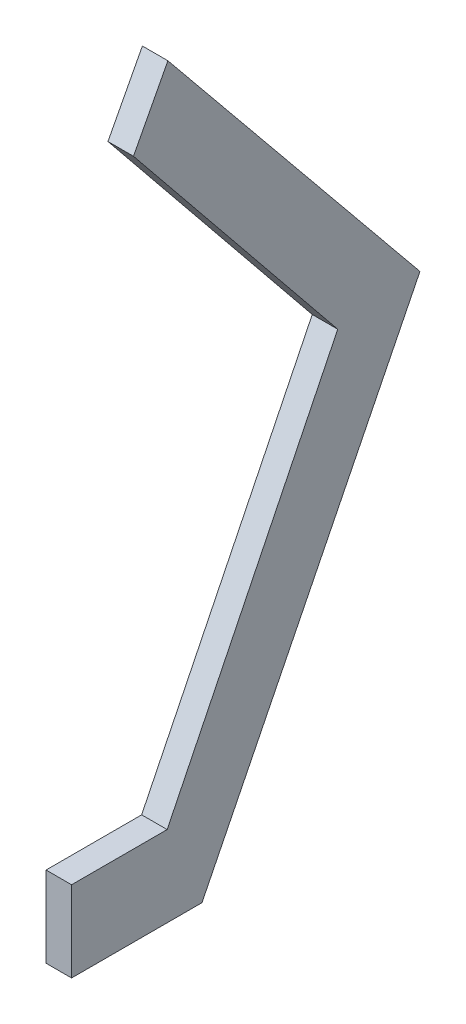
ISO-10303-21;
HEADER;
FILE_DESCRIPTION(('STEP AP214'),'2;1');
FILE_NAME('part.step','',(''),(''),'','','');
FILE_SCHEMA(('AUTOMOTIVE_DESIGN { 1 0 10303 214 1 1 1 1 }'));
ENDSEC;
DATA;
#1=APPLICATION_CONTEXT('core data for automotive mechanical design processes');
#2=APPLICATION_PROTOCOL_DEFINITION('international standard','automotive_design',2000,#1);
#3=PRODUCT_CONTEXT('',#1,'mechanical');
#4=PRODUCT('Part','Part','',(#3));
#5=PRODUCT_RELATED_PRODUCT_CATEGORY('part','',(#4));
#6=PRODUCT_DEFINITION_FORMATION('','',#4);
#7=PRODUCT_DEFINITION_CONTEXT('part definition',#1,'design');
#8=PRODUCT_DEFINITION('design','',#6,#7);
#9=PRODUCT_DEFINITION_SHAPE('','',#8);
#10=(LENGTH_UNIT() NAMED_UNIT(*) SI_UNIT(.MILLI.,.METRE.));
#11=(NAMED_UNIT(*) PLANE_ANGLE_UNIT() SI_UNIT($,.RADIAN.));
#12=(NAMED_UNIT(*) SI_UNIT($,.STERADIAN.) SOLID_ANGLE_UNIT());
#13=UNCERTAINTY_MEASURE_WITH_UNIT(LENGTH_MEASURE(1.E-05),#10,'distance_accuracy_value','');
#14=(GEOMETRIC_REPRESENTATION_CONTEXT(3) GLOBAL_UNCERTAINTY_ASSIGNED_CONTEXT((#13)) GLOBAL_UNIT_ASSIGNED_CONTEXT((#10,
#11,#12)) REPRESENTATION_CONTEXT('',''));
#15=CARTESIAN_POINT('',(0.,0.,0.));
#16=DIRECTION('',(0.,0.,1.));
#17=DIRECTION('',(1.,0.,0.));
#18=AXIS2_PLACEMENT_3D('',#15,#16,#17);
#19=CARTESIAN_POINT('',(1.25,42.8843232325626,-21.3563961229521));
#20=DIRECTION('',(0.,0.445780847435395,0.895142131764437));
#21=DIRECTION('',(0.,-0.895142131764438,0.445780847435395));
#22=AXIS2_PLACEMENT_3D('',#19,#20,#21);
#23=PLANE('',#22);
#24=DIRECTION('',(0.,0.895142131764437,-0.445780847435395));
#25=VECTOR('',#24,1.);
#26=CARTESIAN_POINT('',(-1.25,42.8843232325626,-21.3563961229521));
#27=LINE('',#26,#25);
#28=CARTESIAN_POINT('',(-1.25,0.,0.));
#29=VERTEX_POINT('',#28);
#30=CARTESIAN_POINT('',(-1.25,42.8843232325626,-21.3563961229521));
#31=VERTEX_POINT('',#30);
#32=EDGE_CURVE('E129',#29,#31,#27,.T.);
#33=ORIENTED_EDGE('',*,*,#32,.T.);
#34=DIRECTION('',(-1.,0.,0.));
#35=VECTOR('',#34,1.);
#36=CARTESIAN_POINT('',(1.25,42.8843232325626,-21.3563961229521));
#37=LINE('',#36,#35);
#38=CARTESIAN_POINT('',(1.25,42.8843232325626,-21.3563961229521));
#39=VERTEX_POINT('',#38);
#40=EDGE_CURVE('E11',#39,#31,#37,.T.);
#41=ORIENTED_EDGE('',*,*,#40,.F.);
#42=DIRECTION('',(0.,0.895142131764437,-0.445780847435395));
#43=VECTOR('',#42,1.);
#44=CARTESIAN_POINT('',(1.25,42.8843232325626,-21.3563961229521));
#45=LINE('',#44,#43);
#46=CARTESIAN_POINT('',(1.25,0.,0.));
#47=VERTEX_POINT('',#46);
#48=EDGE_CURVE('E143',#47,#39,#45,.T.);
#49=ORIENTED_EDGE('',*,*,#48,.F.);
#50=DIRECTION('',(-1.,0.,0.));
#51=VECTOR('',#50,1.);
#52=CARTESIAN_POINT('',(1.25,0.,0.));
#53=LINE('',#52,#51);
#54=EDGE_CURVE('E125',#47,#29,#53,.T.);
#55=ORIENTED_EDGE('',*,*,#54,.T.);
#56=EDGE_LOOP('',(#33,#41,#49,#55));
#57=FACE_BOUND('',#56,.T.);
#58=ADVANCED_FACE('F33',(#57),#23,.F.);
#59=CARTESIAN_POINT('',(1.25,73.1064460764563,3.33666023018075));
#60=DIRECTION('',(0.,-0.632713722563172,0.774385785820125));
#61=DIRECTION('',(0.,-0.774385785820125,-0.632713722563172));
#62=AXIS2_PLACEMENT_3D('',#59,#60,#61);
#63=PLANE('',#62);
#64=DIRECTION('',(0.,0.774385785820125,0.632713722563172));
#65=VECTOR('',#64,1.);
#66=CARTESIAN_POINT('',(-1.25,73.1064460764563,3.33666023018075));
#67=LINE('',#66,#65);
#68=CARTESIAN_POINT('',(-1.25,73.1064460764563,3.33666023018075));
#69=VERTEX_POINT('',#68);
#70=EDGE_CURVE('E132',#31,#69,#67,.T.);
#71=ORIENTED_EDGE('',*,*,#70,.T.);
#72=DIRECTION('',(-1.,0.,0.));
#73=VECTOR('',#72,1.);
#74=CARTESIAN_POINT('',(1.25,73.1064460764563,3.33666023018075));
#75=LINE('',#74,#73);
#76=CARTESIAN_POINT('',(1.25,73.1064460764563,3.33666023018075));
#77=VERTEX_POINT('',#76);
#78=EDGE_CURVE('E41',#77,#69,#75,.T.);
#79=ORIENTED_EDGE('',*,*,#78,.F.);
#80=DIRECTION('',(0.,0.774385785820125,0.632713722563172));
#81=VECTOR('',#80,1.);
#82=CARTESIAN_POINT('',(1.25,73.1064460764563,3.33666023018075));
#83=LINE('',#82,#81);
#84=EDGE_CURVE('E92',#39,#77,#83,.T.);
#85=ORIENTED_EDGE('',*,*,#84,.F.);
#86=ORIENTED_EDGE('',*,*,#40,.T.);
#87=EDGE_LOOP('',(#71,#79,#85,#86));
#88=FACE_BOUND('',#87,.T.);
#89=ADVANCED_FACE('F178',(#88),#63,.F.);
#90=CARTESIAN_POINT('',(1.25,66.6890595620744,6.70936055416993));
#91=DIRECTION('',(0.,-0.465220149048029,-0.885195014061721));
#92=DIRECTION('',(0.,0.885195014061721,-0.465220149048029));
#93=AXIS2_PLACEMENT_3D('',#90,#91,#92);
#94=PLANE('',#93);
#95=DIRECTION('',(0.,-0.885195014061721,0.465220149048029));
#96=VECTOR('',#95,1.);
#97=CARTESIAN_POINT('',(-1.25,66.6890595620744,6.70936055416993));
#98=LINE('',#97,#96);
#99=CARTESIAN_POINT('',(-1.25,66.6890595620744,6.70936055416993));
#100=VERTEX_POINT('',#99);
#101=EDGE_CURVE('E134',#69,#100,#98,.T.);
#102=ORIENTED_EDGE('',*,*,#101,.T.);
#103=DIRECTION('',(-1.,0.,0.));
#104=VECTOR('',#103,1.);
#105=CARTESIAN_POINT('',(1.25,66.6890595620744,6.70936055416993));
#106=LINE('',#105,#104);
#107=CARTESIAN_POINT('',(1.25,66.6890595620744,6.70936055416993));
#108=VERTEX_POINT('',#107);
#109=EDGE_CURVE('E150',#108,#100,#106,.T.);
#110=ORIENTED_EDGE('',*,*,#109,.F.);
#111=DIRECTION('',(0.,-0.885195014061721,0.465220149048029));
#112=VECTOR('',#111,1.);
#113=CARTESIAN_POINT('',(1.25,66.6890595620744,6.70936055416993));
#114=LINE('',#113,#112);
#115=EDGE_CURVE('E158',#77,#108,#114,.T.);
#116=ORIENTED_EDGE('',*,*,#115,.F.);
#117=ORIENTED_EDGE('',*,*,#78,.T.);
#118=EDGE_LOOP('',(#102,#110,#116,#117));
#119=FACE_BOUND('',#118,.T.);
#120=ADVANCED_FACE('F156',(#119),#94,.F.);
#121=CARTESIAN_POINT('',(1.25,42.0052081097485,-13.3040026723306));
#122=DIRECTION('',(0.,0.629791128761343,-0.776764529399685));
#123=DIRECTION('',(0.,0.776764529399685,0.629791128761343));
#124=AXIS2_PLACEMENT_3D('',#121,#122,#123);
#125=PLANE('',#124);
#126=DIRECTION('',(0.,-0.776764529399685,-0.629791128761343));
#127=VECTOR('',#126,1.);
#128=CARTESIAN_POINT('',(-1.25,42.0052081097485,-13.3040026723306));
#129=LINE('',#128,#127);
#130=CARTESIAN_POINT('',(-1.25,42.0052081097485,-13.3040026723306));
#131=VERTEX_POINT('',#130);
#132=EDGE_CURVE('E136',#100,#131,#129,.T.);
#133=ORIENTED_EDGE('',*,*,#132,.T.);
#134=DIRECTION('',(-1.,0.,0.));
#135=VECTOR('',#134,1.);
#136=CARTESIAN_POINT('',(1.25,42.0052081097485,-13.3040026723306));
#137=LINE('',#136,#135);
#138=CARTESIAN_POINT('',(1.25,42.0052081097485,-13.3040026723306));
#139=VERTEX_POINT('',#138);
#140=EDGE_CURVE('E147',#139,#131,#137,.T.);
#141=ORIENTED_EDGE('',*,*,#140,.F.);
#142=DIRECTION('',(0.,-0.776764529399685,-0.629791128761343));
#143=VECTOR('',#142,1.);
#144=CARTESIAN_POINT('',(1.25,42.0052081097485,-13.3040026723306));
#145=LINE('',#144,#143);
#146=EDGE_CURVE('E170',#108,#139,#145,.T.);
#147=ORIENTED_EDGE('',*,*,#146,.F.);
#148=ORIENTED_EDGE('',*,*,#109,.T.);
#149=EDGE_LOOP('',(#133,#141,#147,#148));
#150=FACE_BOUND('',#149,.T.);
#151=ADVANCED_FACE('F166',(#150),#125,.F.);
#152=CARTESIAN_POINT('',(1.25,7.91180397513269,3.40981613219481));
#153=DIRECTION('',(0.,-0.440186218463673,-0.897906505753606));
#154=DIRECTION('',(0.,0.897906505753607,-0.440186218463673));
#155=AXIS2_PLACEMENT_3D('',#152,#153,#154);
#156=PLANE('',#155);
#157=DIRECTION('',(0.,-0.897906505753606,0.440186218463673));
#158=VECTOR('',#157,1.);
#159=CARTESIAN_POINT('',(-1.25,7.91180397513269,3.40981613219481));
#160=LINE('',#159,#158);
#161=CARTESIAN_POINT('',(-1.25,7.91180397513269,3.40981613219481));
#162=VERTEX_POINT('',#161);
#163=EDGE_CURVE('E138',#131,#162,#160,.T.);
#164=ORIENTED_EDGE('',*,*,#163,.T.);
#165=DIRECTION('',(-1.,0.,0.));
#166=VECTOR('',#165,1.);
#167=CARTESIAN_POINT('',(1.25,7.91180397513269,3.40981613219481));
#168=LINE('',#167,#166);
#169=CARTESIAN_POINT('',(1.25,7.91180397513269,3.40981613219481));
#170=VERTEX_POINT('',#169);
#171=EDGE_CURVE('E120',#170,#162,#168,.T.);
#172=ORIENTED_EDGE('',*,*,#171,.F.);
#173=DIRECTION('',(0.,-0.897906505753606,0.440186218463673));
#174=VECTOR('',#173,1.);
#175=CARTESIAN_POINT('',(1.25,7.91180397513269,3.40981613219481));
#176=LINE('',#175,#174);
#177=EDGE_CURVE('E111',#139,#170,#176,.T.);
#178=ORIENTED_EDGE('',*,*,#177,.F.);
#179=ORIENTED_EDGE('',*,*,#140,.T.);
#180=EDGE_LOOP('',(#164,#172,#178,#179));
#181=FACE_BOUND('',#180,.T.);
#182=ADVANCED_FACE('F169',(#181),#156,.F.);
#183=CARTESIAN_POINT('',(1.25,7.91180397513269,12.7741611434406));
#184=DIRECTION('',(0.,-1.,0.));
#185=DIRECTION('',(0.,0.,-1.));
#186=AXIS2_PLACEMENT_3D('',#183,#184,#185);
#187=PLANE('',#186);
#188=DIRECTION('',(0.,0.,1.));
#189=VECTOR('',#188,1.);
#190=CARTESIAN_POINT('',(-1.25,7.91180397513269,12.7741611434406));
#191=LINE('',#190,#189);
#192=CARTESIAN_POINT('',(-1.25,7.91180397513269,12.7741611434406));
#193=VERTEX_POINT('',#192);
#194=EDGE_CURVE('E119',#162,#193,#191,.T.);
#195=ORIENTED_EDGE('',*,*,#194,.T.);
#196=DIRECTION('',(-1.,0.,0.));
#197=VECTOR('',#196,1.);
#198=CARTESIAN_POINT('',(1.25,7.91180397513269,12.7741611434406));
#199=LINE('',#198,#197);
#200=CARTESIAN_POINT('',(1.25,7.91180397513269,12.7741611434406));
#201=VERTEX_POINT('',#200);
#202=EDGE_CURVE('E116',#201,#193,#199,.T.);
#203=ORIENTED_EDGE('',*,*,#202,.F.);
#204=DIRECTION('',(0.,0.,1.));
#205=VECTOR('',#204,1.);
#206=CARTESIAN_POINT('',(1.25,7.91180397513269,12.7741611434406));
#207=LINE('',#206,#205);
#208=EDGE_CURVE('E105',#170,#201,#207,.T.);
#209=ORIENTED_EDGE('',*,*,#208,.F.);
#210=ORIENTED_EDGE('',*,*,#171,.T.);
#211=EDGE_LOOP('',(#195,#203,#209,#210));
#212=FACE_BOUND('',#211,.T.);
#213=ADVANCED_FACE('F117',(#212),#187,.F.);
#214=CARTESIAN_POINT('',(1.25,0.,12.7741611434406));
#215=DIRECTION('',(0.,0.,-1.));
#216=DIRECTION('',(-1.,0.,0.));
#217=AXIS2_PLACEMENT_3D('',#214,#215,#216);
#218=PLANE('',#217);
#219=DIRECTION('',(0.,-1.,0.));
#220=VECTOR('',#219,1.);
#221=CARTESIAN_POINT('',(-1.25,0.,12.7741611434406));
#222=LINE('',#221,#220);
#223=CARTESIAN_POINT('',(-1.25,0.,12.7741611434406));
#224=VERTEX_POINT('',#223);
#225=EDGE_CURVE('E78',#193,#224,#222,.T.);
#226=ORIENTED_EDGE('',*,*,#225,.T.);
#227=DIRECTION('',(-1.,0.,0.));
#228=VECTOR('',#227,1.);
#229=CARTESIAN_POINT('',(1.25,0.,12.7741611434406));
#230=LINE('',#229,#228);
#231=CARTESIAN_POINT('',(1.25,0.,12.7741611434406));
#232=VERTEX_POINT('',#231);
#233=EDGE_CURVE('E121',#232,#224,#230,.T.);
#234=ORIENTED_EDGE('',*,*,#233,.F.);
#235=DIRECTION('',(0.,-1.,0.));
#236=VECTOR('',#235,1.);
#237=CARTESIAN_POINT('',(1.25,0.,12.7741611434406));
#238=LINE('',#237,#236);
#239=EDGE_CURVE('E109',#201,#232,#238,.T.);
#240=ORIENTED_EDGE('',*,*,#239,.F.);
#241=ORIENTED_EDGE('',*,*,#202,.T.);
#242=EDGE_LOOP('',(#226,#234,#240,#241));
#243=FACE_BOUND('',#242,.T.);
#244=ADVANCED_FACE('F123',(#243),#218,.F.);
#245=CARTESIAN_POINT('',(1.25,0.,0.));
#246=DIRECTION('',(0.,1.,0.));
#247=DIRECTION('',(0.,0.,1.));
#248=AXIS2_PLACEMENT_3D('',#245,#246,#247);
#249=PLANE('',#248);
#250=DIRECTION('',(0.,0.,-1.));
#251=VECTOR('',#250,1.);
#252=CARTESIAN_POINT('',(-1.25,0.,0.));
#253=LINE('',#252,#251);
#254=EDGE_CURVE('E84',#224,#29,#253,.T.);
#255=ORIENTED_EDGE('',*,*,#254,.T.);
#256=ORIENTED_EDGE('',*,*,#54,.F.);
#257=DIRECTION('',(0.,0.,-1.));
#258=VECTOR('',#257,1.);
#259=CARTESIAN_POINT('',(1.25,0.,0.));
#260=LINE('',#259,#258);
#261=EDGE_CURVE('E49',#232,#47,#260,.T.);
#262=ORIENTED_EDGE('',*,*,#261,.F.);
#263=ORIENTED_EDGE('',*,*,#233,.T.);
#264=EDGE_LOOP('',(#255,#256,#262,#263));
#265=FACE_BOUND('',#264,.T.);
#266=ADVANCED_FACE('F194',(#265),#249,.F.);
#267=CARTESIAN_POINT('',(1.25,0.,0.));
#268=DIRECTION('',(1.,0.,0.));
#269=DIRECTION('',(0.,0.,-1.));
#270=AXIS2_PLACEMENT_3D('',#267,#268,#269);
#271=PLANE('',#270);
#272=ORIENTED_EDGE('',*,*,#48,.T.);
#273=ORIENTED_EDGE('',*,*,#84,.T.);
#274=ORIENTED_EDGE('',*,*,#115,.T.);
#275=ORIENTED_EDGE('',*,*,#146,.T.);
#276=ORIENTED_EDGE('',*,*,#177,.T.);
#277=ORIENTED_EDGE('',*,*,#208,.T.);
#278=ORIENTED_EDGE('',*,*,#239,.T.);
#279=ORIENTED_EDGE('',*,*,#261,.T.);
#280=EDGE_LOOP('',(#272,#273,#274,#275,#276,#277,#278,#279));
#281=FACE_BOUND('',#280,.T.);
#282=ADVANCED_FACE('F107',(#281),#271,.T.);
#283=CARTESIAN_POINT('',(-1.25,0.,0.));
#284=DIRECTION('',(1.,0.,0.));
#285=DIRECTION('',(0.,0.,-1.));
#286=AXIS2_PLACEMENT_3D('',#283,#284,#285);
#287=PLANE('',#286);
#288=ORIENTED_EDGE('',*,*,#32,.F.);
#289=ORIENTED_EDGE('',*,*,#254,.F.);
#290=ORIENTED_EDGE('',*,*,#225,.F.);
#291=ORIENTED_EDGE('',*,*,#194,.F.);
#292=ORIENTED_EDGE('',*,*,#163,.F.);
#293=ORIENTED_EDGE('',*,*,#132,.F.);
#294=ORIENTED_EDGE('',*,*,#101,.F.);
#295=ORIENTED_EDGE('',*,*,#70,.F.);
#296=EDGE_LOOP('',(#288,#289,#290,#291,#292,#293,#294,#295));
#297=FACE_BOUND('',#296,.T.);
#298=ADVANCED_FACE('F162',(#297),#287,.F.);
#299=CLOSED_SHELL('',(#58,#89,#120,#151,#182,#213,#244,#266,#282,#298));
#300=MANIFOLD_SOLID_BREP('B2',#299);
#301=ADVANCED_BREP_SHAPE_REPRESENTATION('',(#18,#300),#14);
#302=SHAPE_DEFINITION_REPRESENTATION(#9,#301);
ENDSEC;
END-ISO-10303-21;
